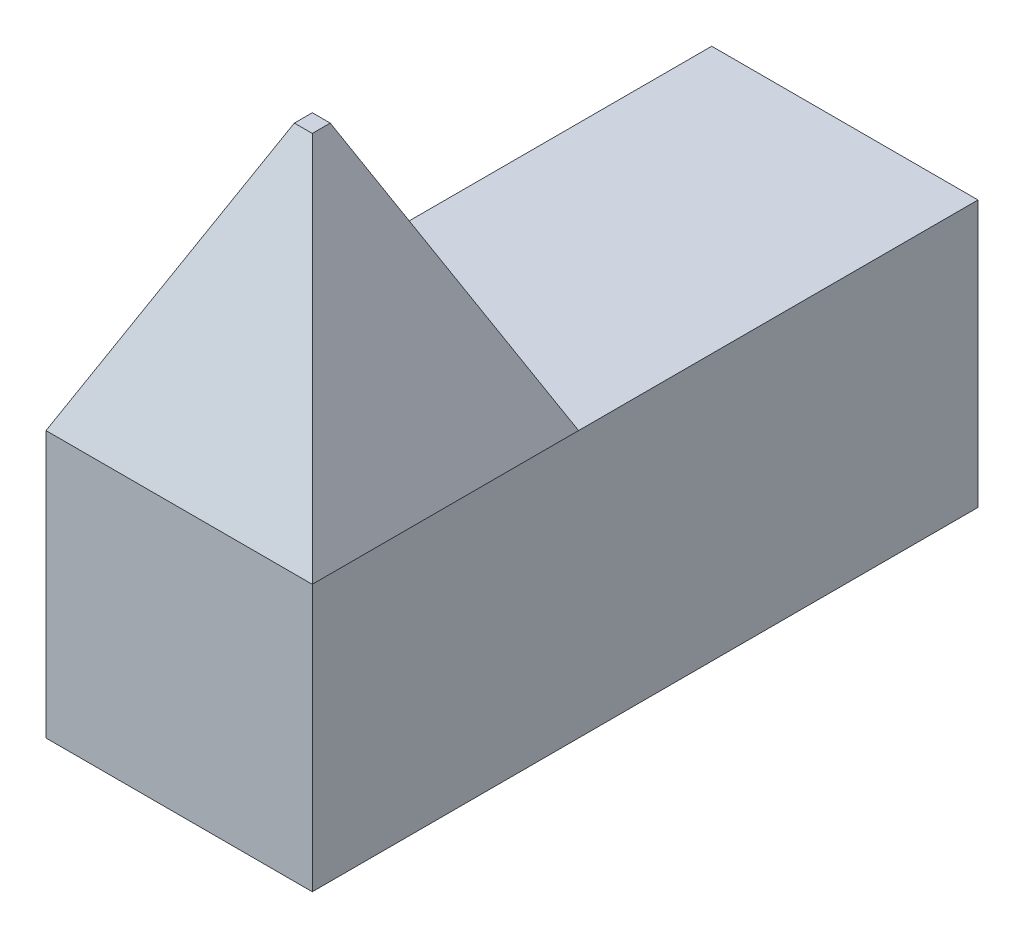
ISO-10303-21;
HEADER;
FILE_DESCRIPTION(('STEP AP214'),'2;1');
FILE_NAME('part.step','',(''),(''),'','','');
FILE_SCHEMA(('AUTOMOTIVE_DESIGN { 1 0 10303 214 1 1 1 1 }'));
ENDSEC;
DATA;
#1=APPLICATION_CONTEXT('core data for automotive mechanical design processes');
#2=APPLICATION_PROTOCOL_DEFINITION('international standard','automotive_design',2000,#1);
#3=PRODUCT_CONTEXT('',#1,'mechanical');
#4=PRODUCT('Part','Part','',(#3));
#5=PRODUCT_RELATED_PRODUCT_CATEGORY('part','',(#4));
#6=PRODUCT_DEFINITION_FORMATION('','',#4);
#7=PRODUCT_DEFINITION_CONTEXT('part definition',#1,'design');
#8=PRODUCT_DEFINITION('design','',#6,#7);
#9=PRODUCT_DEFINITION_SHAPE('','',#8);
#10=(LENGTH_UNIT() NAMED_UNIT(*) SI_UNIT(.MILLI.,.METRE.));
#11=(NAMED_UNIT(*) PLANE_ANGLE_UNIT() SI_UNIT($,.RADIAN.));
#12=(NAMED_UNIT(*) SI_UNIT($,.STERADIAN.) SOLID_ANGLE_UNIT());
#13=UNCERTAINTY_MEASURE_WITH_UNIT(LENGTH_MEASURE(1.E-05),#10,'distance_accuracy_value','');
#14=(GEOMETRIC_REPRESENTATION_CONTEXT(3) GLOBAL_UNCERTAINTY_ASSIGNED_CONTEXT((#13)) GLOBAL_UNIT_ASSIGNED_CONTEXT((#10,
#11,#12)) REPRESENTATION_CONTEXT('',''));
#15=CARTESIAN_POINT('',(0.,0.,0.));
#16=DIRECTION('',(0.,0.,1.));
#17=DIRECTION('',(1.,0.,0.));
#18=AXIS2_PLACEMENT_3D('',#15,#16,#17);
#19=CARTESIAN_POINT('',(0.,40.,100.));
#20=DIRECTION('',(0.,-1.,0.));
#21=DIRECTION('',(0.,0.,-1.));
#22=AXIS2_PLACEMENT_3D('',#19,#20,#21);
#23=PLANE('',#22);
#24=DIRECTION('',(-1.,0.,0.));
#25=VECTOR('',#24,1.);
#26=CARTESIAN_POINT('',(0.,40.,60.));
#27=LINE('',#26,#25);
#28=CARTESIAN_POINT('',(40.,40.,60.));
#29=VERTEX_POINT('',#28);
#30=CARTESIAN_POINT('',(0.,40.,60.));
#31=VERTEX_POINT('',#30);
#32=EDGE_CURVE('E50',#29,#31,#27,.T.);
#33=ORIENTED_EDGE('',*,*,#32,.F.);
#34=DIRECTION('',(0.,0.,-1.));
#35=VECTOR('',#34,1.);
#36=CARTESIAN_POINT('',(40.,40.,100.));
#37=LINE('',#36,#35);
#38=CARTESIAN_POINT('',(40.,40.,0.));
#39=VERTEX_POINT('',#38);
#40=EDGE_CURVE('E108',#29,#39,#37,.T.);
#41=ORIENTED_EDGE('',*,*,#40,.T.);
#42=DIRECTION('',(-1.,0.,0.));
#43=VECTOR('',#42,1.);
#44=CARTESIAN_POINT('',(0.,40.,0.));
#45=LINE('',#44,#43);
#46=CARTESIAN_POINT('',(0.,40.,0.));
#47=VERTEX_POINT('',#46);
#48=EDGE_CURVE('E111',#39,#47,#45,.T.);
#49=ORIENTED_EDGE('',*,*,#48,.T.);
#50=DIRECTION('',(0.,0.,-1.));
#51=VECTOR('',#50,1.);
#52=CARTESIAN_POINT('',(0.,40.,100.));
#53=LINE('',#52,#51);
#54=EDGE_CURVE('E79',#31,#47,#53,.T.);
#55=ORIENTED_EDGE('',*,*,#54,.F.);
#56=EDGE_LOOP('',(#33,#41,#49,#55));
#57=FACE_BOUND('',#56,.T.);
#58=ADVANCED_FACE('F33',(#57),#23,.F.);
#59=CARTESIAN_POINT('',(0.,0.,100.));
#60=DIRECTION('',(1.,0.,0.));
#61=DIRECTION('',(0.,0.,-1.));
#62=AXIS2_PLACEMENT_3D('',#59,#60,#61);
#63=PLANE('',#62);
#64=DIRECTION('',(0.,-1.,0.));
#65=VECTOR('',#64,1.);
#66=CARTESIAN_POINT('',(0.,0.,0.));
#67=LINE('',#66,#65);
#68=CARTESIAN_POINT('',(0.,0.,0.));
#69=VERTEX_POINT('',#68);
#70=EDGE_CURVE('E143',#47,#69,#67,.T.);
#71=ORIENTED_EDGE('',*,*,#70,.T.);
#72=DIRECTION('',(0.,0.,-1.));
#73=VECTOR('',#72,1.);
#74=CARTESIAN_POINT('',(0.,0.,100.));
#75=LINE('',#74,#73);
#76=CARTESIAN_POINT('',(0.,0.,100.));
#77=VERTEX_POINT('',#76);
#78=EDGE_CURVE('E11',#77,#69,#75,.T.);
#79=ORIENTED_EDGE('',*,*,#78,.F.);
#80=DIRECTION('',(0.,-1.,0.));
#81=VECTOR('',#80,1.);
#82=CARTESIAN_POINT('',(0.,0.,100.));
#83=LINE('',#82,#81);
#84=CARTESIAN_POINT('',(0.,40.,100.));
#85=VERTEX_POINT('',#84);
#86=EDGE_CURVE('E103',#85,#77,#83,.T.);
#87=ORIENTED_EDGE('',*,*,#86,.F.);
#88=EDGE_CURVE('E101',#85,#31,#53,.T.);
#89=ORIENTED_EDGE('',*,*,#88,.T.);
#90=ORIENTED_EDGE('',*,*,#54,.T.);
#91=EDGE_LOOP('',(#71,#79,#87,#89,#90));
#92=FACE_BOUND('',#91,.T.);
#93=ADVANCED_FACE('F35',(#92),#63,.F.);
#94=CARTESIAN_POINT('',(0.,0.,100.));
#95=DIRECTION('',(0.,1.,0.));
#96=DIRECTION('',(0.,0.,1.));
#97=AXIS2_PLACEMENT_3D('',#94,#95,#96);
#98=PLANE('',#97);
#99=DIRECTION('',(1.,0.,0.));
#100=VECTOR('',#99,1.);
#101=CARTESIAN_POINT('',(0.,0.,0.));
#102=LINE('',#101,#100);
#103=CARTESIAN_POINT('',(40.,0.,0.));
#104=VERTEX_POINT('',#103);
#105=EDGE_CURVE('E156',#69,#104,#102,.T.);
#106=ORIENTED_EDGE('',*,*,#105,.T.);
#107=DIRECTION('',(0.,0.,-1.));
#108=VECTOR('',#107,1.);
#109=CARTESIAN_POINT('',(40.,0.,100.));
#110=LINE('',#109,#108);
#111=CARTESIAN_POINT('',(40.,0.,100.));
#112=VERTEX_POINT('',#111);
#113=EDGE_CURVE('E42',#112,#104,#110,.T.);
#114=ORIENTED_EDGE('',*,*,#113,.F.);
#115=DIRECTION('',(1.,0.,0.));
#116=VECTOR('',#115,1.);
#117=CARTESIAN_POINT('',(0.,0.,100.));
#118=LINE('',#117,#116);
#119=EDGE_CURVE('E86',#77,#112,#118,.T.);
#120=ORIENTED_EDGE('',*,*,#119,.F.);
#121=ORIENTED_EDGE('',*,*,#78,.T.);
#122=EDGE_LOOP('',(#106,#114,#120,#121));
#123=FACE_BOUND('',#122,.T.);
#124=ADVANCED_FACE('F176',(#123),#98,.F.);
#125=CARTESIAN_POINT('',(40.,0.,100.));
#126=DIRECTION('',(-1.,0.,0.));
#127=DIRECTION('',(0.,0.,1.));
#128=AXIS2_PLACEMENT_3D('',#125,#126,#127);
#129=PLANE('',#128);
#130=DIRECTION('',(0.,1.,0.));
#131=VECTOR('',#130,1.);
#132=CARTESIAN_POINT('',(40.,0.,0.));
#133=LINE('',#132,#131);
#134=EDGE_CURVE('E158',#104,#39,#133,.T.);
#135=ORIENTED_EDGE('',*,*,#134,.T.);
#136=ORIENTED_EDGE('',*,*,#40,.F.);
#137=CARTESIAN_POINT('',(40.,40.,100.));
#138=VERTEX_POINT('',#137);
#139=EDGE_CURVE('E136',#138,#29,#37,.T.);
#140=ORIENTED_EDGE('',*,*,#139,.F.);
#141=DIRECTION('',(0.,1.,0.));
#142=VECTOR('',#141,1.);
#143=CARTESIAN_POINT('',(40.,0.,100.));
#144=LINE('',#143,#142);
#145=EDGE_CURVE('E152',#112,#138,#144,.T.);
#146=ORIENTED_EDGE('',*,*,#145,.F.);
#147=ORIENTED_EDGE('',*,*,#113,.T.);
#148=EDGE_LOOP('',(#135,#136,#140,#146,#147));
#149=FACE_BOUND('',#148,.T.);
#150=ADVANCED_FACE('F173',(#149),#129,.F.);
#151=CARTESIAN_POINT('',(0.,0.,100.));
#152=DIRECTION('',(0.,0.,-1.));
#153=DIRECTION('',(-1.,0.,0.));
#154=AXIS2_PLACEMENT_3D('',#151,#152,#153);
#155=PLANE('',#154);
#156=ORIENTED_EDGE('',*,*,#86,.T.);
#157=ORIENTED_EDGE('',*,*,#119,.T.);
#158=ORIENTED_EDGE('',*,*,#145,.T.);
#159=DIRECTION('',(-1.,0.,0.));
#160=VECTOR('',#159,1.);
#161=CARTESIAN_POINT('',(0.,40.,100.));
#162=LINE('',#161,#160);
#163=EDGE_CURVE('E59',#138,#85,#162,.T.);
#164=ORIENTED_EDGE('',*,*,#163,.T.);
#165=EDGE_LOOP('',(#156,#157,#158,#164));
#166=FACE_BOUND('',#165,.T.);
#167=ADVANCED_FACE('F182',(#166),#155,.F.);
#168=CARTESIAN_POINT('',(0.,0.,0.));
#169=DIRECTION('',(0.,0.,-1.));
#170=DIRECTION('',(-1.,0.,0.));
#171=AXIS2_PLACEMENT_3D('',#168,#169,#170);
#172=PLANE('',#171);
#173=ORIENTED_EDGE('',*,*,#70,.F.);
#174=ORIENTED_EDGE('',*,*,#48,.F.);
#175=ORIENTED_EDGE('',*,*,#134,.F.);
#176=ORIENTED_EDGE('',*,*,#105,.F.);
#177=EDGE_LOOP('',(#173,#174,#175,#176));
#178=FACE_BOUND('',#177,.T.);
#179=ADVANCED_FACE('F175',(#178),#172,.T.);
#180=CARTESIAN_POINT('',(0.,40.,60.));
#181=DIRECTION('',(-0.906307787036649,0.4226182617407,0.));
#182=DIRECTION('',(-0.4226182617407,-0.90630778703665,0.));
#183=AXIS2_PLACEMENT_3D('',#180,#181,#182);
#184=PLANE('',#183);
#185=ORIENTED_EDGE('',*,*,#88,.F.);
#186=DIRECTION('',(-0.389281620635026,-0.834817129478987,0.389281620635026));
#187=VECTOR('',#186,1.);
#188=CARTESIAN_POINT('',(0.,40.,100.));
#189=LINE('',#188,#187);
#190=CARTESIAN_POINT('',(18.6523063262,80.,81.3476936738));
#191=VERTEX_POINT('',#190);
#192=EDGE_CURVE('E141',#191,#85,#189,.T.);
#193=ORIENTED_EDGE('',*,*,#192,.F.);
#194=DIRECTION('',(0.,0.,-1.));
#195=VECTOR('',#194,1.);
#196=CARTESIAN_POINT('',(18.6523063262,80.,60.));
#197=LINE('',#196,#195);
#198=CARTESIAN_POINT('',(18.6523063262,80.,78.6523063262));
#199=VERTEX_POINT('',#198);
#200=EDGE_CURVE('E123',#199,#191,#197,.F.);
#201=ORIENTED_EDGE('',*,*,#200,.F.);
#202=DIRECTION('',(-0.389281620635026,-0.834817129478987,-0.389281620635026));
#203=VECTOR('',#202,1.);
#204=CARTESIAN_POINT('',(0.,40.,60.));
#205=LINE('',#204,#203);
#206=EDGE_CURVE('E119',#199,#31,#205,.T.);
#207=ORIENTED_EDGE('',*,*,#206,.T.);
#208=EDGE_LOOP('',(#185,#193,#201,#207));
#209=FACE_BOUND('',#208,.T.);
#210=ADVANCED_FACE('F125',(#209),#184,.T.);
#211=CARTESIAN_POINT('',(0.,40.,100.));
#212=DIRECTION('',(0.,0.4226182617407,0.90630778703665));
#213=DIRECTION('',(0.,-0.90630778703665,0.4226182617407));
#214=AXIS2_PLACEMENT_3D('',#211,#212,#213);
#215=PLANE('',#214);
#216=ORIENTED_EDGE('',*,*,#163,.F.);
#217=DIRECTION('',(0.389281620635026,-0.834817129478987,0.389281620635026));
#218=VECTOR('',#217,1.);
#219=CARTESIAN_POINT('',(40.,40.,100.));
#220=LINE('',#219,#218);
#221=CARTESIAN_POINT('',(21.3476936738,80.,81.3476936738));
#222=VERTEX_POINT('',#221);
#223=EDGE_CURVE('E129',#222,#138,#220,.T.);
#224=ORIENTED_EDGE('',*,*,#223,.F.);
#225=DIRECTION('',(-1.,0.,0.));
#226=VECTOR('',#225,1.);
#227=CARTESIAN_POINT('',(0.,80.,81.3476936738));
#228=LINE('',#227,#226);
#229=EDGE_CURVE('E147',#191,#222,#228,.F.);
#230=ORIENTED_EDGE('',*,*,#229,.F.);
#231=ORIENTED_EDGE('',*,*,#192,.T.);
#232=EDGE_LOOP('',(#216,#224,#230,#231));
#233=FACE_BOUND('',#232,.T.);
#234=ADVANCED_FACE('F193',(#233),#215,.T.);
#235=CARTESIAN_POINT('',(40.,40.,100.));
#236=DIRECTION('',(0.90630778703665,0.4226182617407,0.));
#237=DIRECTION('',(-0.4226182617407,0.90630778703665,0.));
#238=AXIS2_PLACEMENT_3D('',#235,#236,#237);
#239=PLANE('',#238);
#240=ORIENTED_EDGE('',*,*,#139,.T.);
#241=DIRECTION('',(0.389281620635026,-0.834817129478987,-0.389281620635026));
#242=VECTOR('',#241,1.);
#243=CARTESIAN_POINT('',(33.9383927934307,52.9991586038984,66.0616072065693));
#244=LINE('',#243,#242);
#245=CARTESIAN_POINT('',(21.3476936738,80.,78.6523063262));
#246=VERTEX_POINT('',#245);
#247=EDGE_CURVE('E122',#246,#29,#244,.T.);
#248=ORIENTED_EDGE('',*,*,#247,.F.);
#249=DIRECTION('',(0.,0.,1.));
#250=VECTOR('',#249,1.);
#251=CARTESIAN_POINT('',(21.3476936738,80.,100.));
#252=LINE('',#251,#250);
#253=EDGE_CURVE('E130',#222,#246,#252,.F.);
#254=ORIENTED_EDGE('',*,*,#253,.F.);
#255=ORIENTED_EDGE('',*,*,#223,.T.);
#256=EDGE_LOOP('',(#240,#248,#254,#255));
#257=FACE_BOUND('',#256,.T.);
#258=ADVANCED_FACE('F196',(#257),#239,.T.);
#259=CARTESIAN_POINT('',(0.,40.,60.));
#260=DIRECTION('',(0.,0.4226182617407,-0.90630778703665));
#261=DIRECTION('',(0.,0.90630778703665,0.4226182617407));
#262=AXIS2_PLACEMENT_3D('',#259,#260,#261);
#263=PLANE('',#262);
#264=ORIENTED_EDGE('',*,*,#32,.T.);
#265=ORIENTED_EDGE('',*,*,#206,.F.);
#266=DIRECTION('',(1.,0.,0.));
#267=VECTOR('',#266,1.);
#268=CARTESIAN_POINT('',(0.,80.,78.6523063262));
#269=LINE('',#268,#267);
#270=EDGE_CURVE('E127',#246,#199,#269,.F.);
#271=ORIENTED_EDGE('',*,*,#270,.F.);
#272=ORIENTED_EDGE('',*,*,#247,.T.);
#273=EDGE_LOOP('',(#264,#265,#271,#272));
#274=FACE_BOUND('',#273,.T.);
#275=ADVANCED_FACE('F117',(#274),#263,.T.);
#276=CARTESIAN_POINT('',(0.,80.,0.));
#277=DIRECTION('',(0.,1.,0.));
#278=DIRECTION('',(0.,0.,1.));
#279=AXIS2_PLACEMENT_3D('',#276,#277,#278);
#280=PLANE('',#279);
#281=ORIENTED_EDGE('',*,*,#200,.T.);
#282=ORIENTED_EDGE('',*,*,#229,.T.);
#283=ORIENTED_EDGE('',*,*,#253,.T.);
#284=ORIENTED_EDGE('',*,*,#270,.T.);
#285=EDGE_LOOP('',(#281,#282,#283,#284));
#286=FACE_BOUND('',#285,.T.);
#287=ADVANCED_FACE('F202',(#286),#280,.T.);
#288=CLOSED_SHELL('',(#58,#93,#124,#150,#167,#179,#210,#234,#258,#275,#287));
#289=MANIFOLD_SOLID_BREP('B2',#288);
#290=ADVANCED_BREP_SHAPE_REPRESENTATION('',(#18,#289),#14);
#291=SHAPE_DEFINITION_REPRESENTATION(#9,#290);
ENDSEC;
END-ISO-10303-21;
